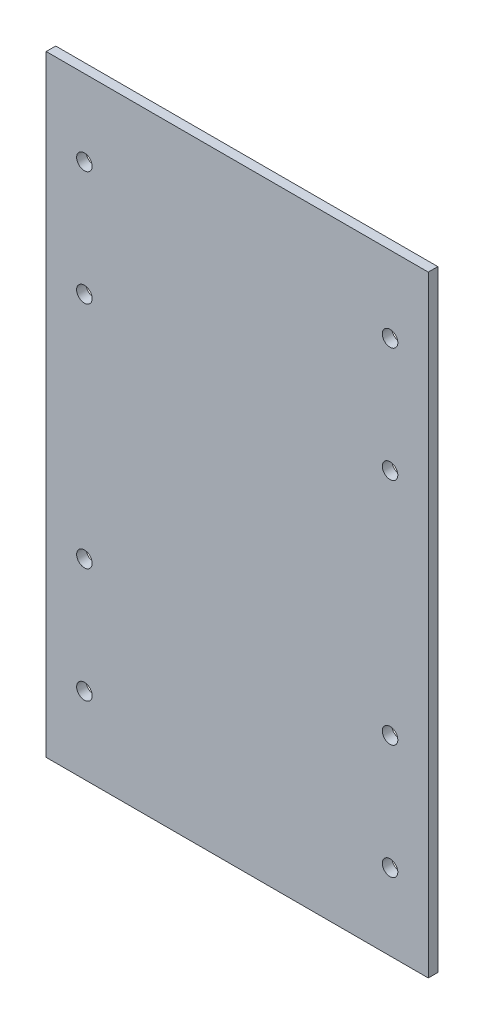
ISO-10303-21;
HEADER;
FILE_DESCRIPTION(('STEP AP214'),'2;1');
FILE_NAME('part.step','',(''),(''),'','','');
FILE_SCHEMA(('AUTOMOTIVE_DESIGN { 1 0 10303 214 1 1 1 1 }'));
ENDSEC;
DATA;
#1=APPLICATION_CONTEXT('core data for automotive mechanical design processes');
#2=APPLICATION_PROTOCOL_DEFINITION('international standard','automotive_design',2000,#1);
#3=PRODUCT_CONTEXT('',#1,'mechanical');
#4=PRODUCT('Part','Part','',(#3));
#5=PRODUCT_RELATED_PRODUCT_CATEGORY('part','',(#4));
#6=PRODUCT_DEFINITION_FORMATION('','',#4);
#7=PRODUCT_DEFINITION_CONTEXT('part definition',#1,'design');
#8=PRODUCT_DEFINITION('design','',#6,#7);
#9=PRODUCT_DEFINITION_SHAPE('','',#8);
#10=(LENGTH_UNIT() NAMED_UNIT(*) SI_UNIT(.MILLI.,.METRE.));
#11=(NAMED_UNIT(*) PLANE_ANGLE_UNIT() SI_UNIT($,.RADIAN.));
#12=(NAMED_UNIT(*) SI_UNIT($,.STERADIAN.) SOLID_ANGLE_UNIT());
#13=UNCERTAINTY_MEASURE_WITH_UNIT(LENGTH_MEASURE(1.E-05),#10,'distance_accuracy_value','');
#14=(GEOMETRIC_REPRESENTATION_CONTEXT(3) GLOBAL_UNCERTAINTY_ASSIGNED_CONTEXT((#13)) GLOBAL_UNIT_ASSIGNED_CONTEXT((#10,
#11,#12)) REPRESENTATION_CONTEXT('',''));
#15=CARTESIAN_POINT('',(0.,0.,0.));
#16=DIRECTION('',(0.,0.,1.));
#17=DIRECTION('',(1.,0.,0.));
#18=AXIS2_PLACEMENT_3D('',#15,#16,#17);
#19=CARTESIAN_POINT('',(63.5,-101.6,3.175));
#20=DIRECTION('',(-1.,0.,0.));
#21=DIRECTION('',(0.,0.,1.));
#22=AXIS2_PLACEMENT_3D('',#19,#20,#21);
#23=PLANE('',#22);
#24=DIRECTION('',(0.,1.,0.));
#25=VECTOR('',#24,1.);
#26=CARTESIAN_POINT('',(63.5,-101.6,0.));
#27=LINE('',#26,#25);
#28=CARTESIAN_POINT('',(63.5,-101.6,0.));
#29=VERTEX_POINT('',#28);
#30=CARTESIAN_POINT('',(63.5,101.6,0.));
#31=VERTEX_POINT('',#30);
#32=EDGE_CURVE('E99',#29,#31,#27,.T.);
#33=ORIENTED_EDGE('',*,*,#32,.T.);
#34=DIRECTION('',(0.,0.,-1.));
#35=VECTOR('',#34,1.);
#36=CARTESIAN_POINT('',(63.5,101.6,3.175));
#37=LINE('',#36,#35);
#38=CARTESIAN_POINT('',(63.5,101.6,3.175));
#39=VERTEX_POINT('',#38);
#40=EDGE_CURVE('E11',#39,#31,#37,.T.);
#41=ORIENTED_EDGE('',*,*,#40,.F.);
#42=DIRECTION('',(0.,1.,0.));
#43=VECTOR('',#42,1.);
#44=CARTESIAN_POINT('',(63.5,-101.6,3.175));
#45=LINE('',#44,#43);
#46=CARTESIAN_POINT('',(63.5,-101.6,3.175));
#47=VERTEX_POINT('',#46);
#48=EDGE_CURVE('E86',#47,#39,#45,.T.);
#49=ORIENTED_EDGE('',*,*,#48,.F.);
#50=DIRECTION('',(0.,0.,-1.));
#51=VECTOR('',#50,1.);
#52=CARTESIAN_POINT('',(63.5,-101.6,3.175));
#53=LINE('',#52,#51);
#54=EDGE_CURVE('E95',#47,#29,#53,.T.);
#55=ORIENTED_EDGE('',*,*,#54,.T.);
#56=EDGE_LOOP('',(#33,#41,#49,#55));
#57=FACE_BOUND('',#56,.T.);
#58=ADVANCED_FACE('F33',(#57),#23,.F.);
#59=CARTESIAN_POINT('',(-63.5,101.6,3.175));
#60=DIRECTION('',(0.,-1.,0.));
#61=DIRECTION('',(0.,0.,-1.));
#62=AXIS2_PLACEMENT_3D('',#59,#60,#61);
#63=PLANE('',#62);
#64=DIRECTION('',(-1.,0.,0.));
#65=VECTOR('',#64,1.);
#66=CARTESIAN_POINT('',(-63.5,101.6,0.));
#67=LINE('',#66,#65);
#68=CARTESIAN_POINT('',(-63.5,101.6,0.));
#69=VERTEX_POINT('',#68);
#70=EDGE_CURVE('E90',#31,#69,#67,.T.);
#71=ORIENTED_EDGE('',*,*,#70,.T.);
#72=DIRECTION('',(0.,0.,-1.));
#73=VECTOR('',#72,1.);
#74=CARTESIAN_POINT('',(-63.5,101.6,3.175));
#75=LINE('',#74,#73);
#76=CARTESIAN_POINT('',(-63.5,101.6,3.175));
#77=VERTEX_POINT('',#76);
#78=EDGE_CURVE('E42',#77,#69,#75,.T.);
#79=ORIENTED_EDGE('',*,*,#78,.F.);
#80=DIRECTION('',(-1.,0.,0.));
#81=VECTOR('',#80,1.);
#82=CARTESIAN_POINT('',(-63.5,101.6,3.175));
#83=LINE('',#82,#81);
#84=EDGE_CURVE('E81',#39,#77,#83,.T.);
#85=ORIENTED_EDGE('',*,*,#84,.F.);
#86=ORIENTED_EDGE('',*,*,#40,.T.);
#87=EDGE_LOOP('',(#71,#79,#85,#86));
#88=FACE_BOUND('',#87,.T.);
#89=ADVANCED_FACE('F89',(#88),#63,.F.);
#90=CARTESIAN_POINT('',(-63.5,-101.6,3.175));
#91=DIRECTION('',(1.,0.,0.));
#92=DIRECTION('',(0.,0.,-1.));
#93=AXIS2_PLACEMENT_3D('',#90,#91,#92);
#94=PLANE('',#93);
#95=DIRECTION('',(0.,-1.,0.));
#96=VECTOR('',#95,1.);
#97=CARTESIAN_POINT('',(-63.5,-101.6,0.));
#98=LINE('',#97,#96);
#99=CARTESIAN_POINT('',(-63.5,-101.6,0.));
#100=VERTEX_POINT('',#99);
#101=EDGE_CURVE('E68',#69,#100,#98,.T.);
#102=ORIENTED_EDGE('',*,*,#101,.T.);
#103=DIRECTION('',(0.,0.,-1.));
#104=VECTOR('',#103,1.);
#105=CARTESIAN_POINT('',(-63.5,-101.6,3.175));
#106=LINE('',#105,#104);
#107=CARTESIAN_POINT('',(-63.5,-101.6,3.175));
#108=VERTEX_POINT('',#107);
#109=EDGE_CURVE('E91',#108,#100,#106,.T.);
#110=ORIENTED_EDGE('',*,*,#109,.F.);
#111=DIRECTION('',(0.,-1.,0.));
#112=VECTOR('',#111,1.);
#113=CARTESIAN_POINT('',(-63.5,-101.6,3.175));
#114=LINE('',#113,#112);
#115=EDGE_CURVE('E84',#77,#108,#114,.T.);
#116=ORIENTED_EDGE('',*,*,#115,.F.);
#117=ORIENTED_EDGE('',*,*,#78,.T.);
#118=EDGE_LOOP('',(#102,#110,#116,#117));
#119=FACE_BOUND('',#118,.T.);
#120=ADVANCED_FACE('F93',(#119),#94,.F.);
#121=CARTESIAN_POINT('',(-63.5,-101.6,3.175));
#122=DIRECTION('',(0.,1.,0.));
#123=DIRECTION('',(0.,0.,1.));
#124=AXIS2_PLACEMENT_3D('',#121,#122,#123);
#125=PLANE('',#124);
#126=DIRECTION('',(1.,0.,0.));
#127=VECTOR('',#126,1.);
#128=CARTESIAN_POINT('',(-63.5,-101.6,0.));
#129=LINE('',#128,#127);
#130=EDGE_CURVE('E74',#100,#29,#129,.T.);
#131=ORIENTED_EDGE('',*,*,#130,.T.);
#132=ORIENTED_EDGE('',*,*,#54,.F.);
#133=DIRECTION('',(1.,0.,0.));
#134=VECTOR('',#133,1.);
#135=CARTESIAN_POINT('',(-63.5,-101.6,3.175));
#136=LINE('',#135,#134);
#137=EDGE_CURVE('E51',#108,#47,#136,.T.);
#138=ORIENTED_EDGE('',*,*,#137,.F.);
#139=ORIENTED_EDGE('',*,*,#109,.T.);
#140=EDGE_LOOP('',(#131,#132,#138,#139));
#141=FACE_BOUND('',#140,.T.);
#142=ADVANCED_FACE('F158',(#141),#125,.F.);
#143=CARTESIAN_POINT('',(0.,0.,3.175));
#144=DIRECTION('',(0.,0.,-1.));
#145=DIRECTION('',(-1.,0.,0.));
#146=AXIS2_PLACEMENT_3D('',#143,#144,#145);
#147=PLANE('',#146);
#148=CARTESIAN_POINT('',(50.8,38.1,3.175));
#149=DIRECTION('',(0.,0.,-1.));
#150=DIRECTION('',(-1.,0.,0.));
#151=AXIS2_PLACEMENT_3D('',#148,#149,#150);
#152=CIRCLE('',#151,2.5796875);
#153=CARTESIAN_POINT('',(48.2203125,38.1,3.175));
#154=VERTEX_POINT('',#153);
#155=EDGE_CURVE('E129',#154,#154,#152,.T.);
#156=ORIENTED_EDGE('',*,*,#155,.T.);
#157=EDGE_LOOP('',(#156));
#158=FACE_BOUND('',#157,.T.);
#159=CARTESIAN_POINT('',(50.8,-38.1,3.175));
#160=DIRECTION('',(0.,0.,-1.));
#161=DIRECTION('',(-1.,0.,0.));
#162=AXIS2_PLACEMENT_3D('',#159,#160,#161);
#163=CIRCLE('',#162,2.5796875);
#164=CARTESIAN_POINT('',(48.2203125,-38.1,3.175));
#165=VERTEX_POINT('',#164);
#166=EDGE_CURVE('E281',#165,#165,#163,.T.);
#167=ORIENTED_EDGE('',*,*,#166,.T.);
#168=EDGE_LOOP('',(#167));
#169=FACE_BOUND('',#168,.T.);
#170=CARTESIAN_POINT('',(50.8,-76.2,3.175));
#171=DIRECTION('',(0.,0.,-1.));
#172=DIRECTION('',(-1.,0.,0.));
#173=AXIS2_PLACEMENT_3D('',#170,#171,#172);
#174=CIRCLE('',#173,2.5796875);
#175=CARTESIAN_POINT('',(48.2203125,-76.2,3.175));
#176=VERTEX_POINT('',#175);
#177=EDGE_CURVE('E142',#176,#176,#174,.T.);
#178=ORIENTED_EDGE('',*,*,#177,.T.);
#179=EDGE_LOOP('',(#178));
#180=FACE_BOUND('',#179,.T.);
#181=CARTESIAN_POINT('',(50.8,76.2,3.175));
#182=DIRECTION('',(0.,0.,-1.));
#183=DIRECTION('',(-1.,0.,0.));
#184=AXIS2_PLACEMENT_3D('',#181,#182,#183);
#185=CIRCLE('',#184,2.5796875);
#186=CARTESIAN_POINT('',(48.2203125,76.2,3.175));
#187=VERTEX_POINT('',#186);
#188=EDGE_CURVE('E125',#187,#187,#185,.T.);
#189=ORIENTED_EDGE('',*,*,#188,.T.);
#190=EDGE_LOOP('',(#189));
#191=FACE_BOUND('',#190,.T.);
#192=CARTESIAN_POINT('',(-50.8,38.1,3.175));
#193=DIRECTION('',(0.,0.,1.));
#194=DIRECTION('',(1.,0.,0.));
#195=AXIS2_PLACEMENT_3D('',#192,#193,#194);
#196=CIRCLE('',#195,2.5796875);
#197=CARTESIAN_POINT('',(-48.2203125,38.1,3.175));
#198=VERTEX_POINT('',#197);
#199=EDGE_CURVE('E115',#198,#198,#196,.T.);
#200=ORIENTED_EDGE('',*,*,#199,.F.);
#201=EDGE_LOOP('',(#200));
#202=FACE_BOUND('',#201,.T.);
#203=CARTESIAN_POINT('',(-50.8,-38.1,3.175));
#204=DIRECTION('',(0.,0.,1.));
#205=DIRECTION('',(1.,0.,0.));
#206=AXIS2_PLACEMENT_3D('',#203,#204,#205);
#207=CIRCLE('',#206,2.5796875);
#208=CARTESIAN_POINT('',(-48.2203125,-38.1,3.175));
#209=VERTEX_POINT('',#208);
#210=EDGE_CURVE('E146',#209,#209,#207,.T.);
#211=ORIENTED_EDGE('',*,*,#210,.F.);
#212=EDGE_LOOP('',(#211));
#213=FACE_BOUND('',#212,.T.);
#214=CARTESIAN_POINT('',(-50.8,-76.2,3.175));
#215=DIRECTION('',(0.,0.,1.));
#216=DIRECTION('',(1.,0.,0.));
#217=AXIS2_PLACEMENT_3D('',#214,#215,#216);
#218=CIRCLE('',#217,2.5796875);
#219=CARTESIAN_POINT('',(-48.2203125,-76.2,3.175));
#220=VERTEX_POINT('',#219);
#221=EDGE_CURVE('E124',#220,#220,#218,.T.);
#222=ORIENTED_EDGE('',*,*,#221,.F.);
#223=EDGE_LOOP('',(#222));
#224=FACE_BOUND('',#223,.T.);
#225=CARTESIAN_POINT('',(-50.8,76.2,3.175));
#226=DIRECTION('',(0.,0.,1.));
#227=DIRECTION('',(1.,0.,0.));
#228=AXIS2_PLACEMENT_3D('',#225,#226,#227);
#229=CIRCLE('',#228,2.5796875);
#230=CARTESIAN_POINT('',(-48.2203125,76.2,3.175));
#231=VERTEX_POINT('',#230);
#232=EDGE_CURVE('E110',#231,#231,#229,.T.);
#233=ORIENTED_EDGE('',*,*,#232,.F.);
#234=EDGE_LOOP('',(#233));
#235=FACE_BOUND('',#234,.T.);
#236=ORIENTED_EDGE('',*,*,#48,.T.);
#237=ORIENTED_EDGE('',*,*,#84,.T.);
#238=ORIENTED_EDGE('',*,*,#115,.T.);
#239=ORIENTED_EDGE('',*,*,#137,.T.);
#240=EDGE_LOOP('',(#236,#237,#238,#239));
#241=FACE_BOUND('',#240,.T.);
#242=ADVANCED_FACE('F82',(#158,#169,#180,#191,#202,#213,#224,#235,#241),#147,.F.);
#243=CARTESIAN_POINT('',(0.,0.,0.));
#244=DIRECTION('',(0.,0.,-1.));
#245=DIRECTION('',(-1.,0.,0.));
#246=AXIS2_PLACEMENT_3D('',#243,#244,#245);
#247=PLANE('',#246);
#248=CARTESIAN_POINT('',(50.8,38.1,0.));
#249=DIRECTION('',(0.,0.,-1.));
#250=DIRECTION('',(-1.,0.,0.));
#251=AXIS2_PLACEMENT_3D('',#248,#249,#250);
#252=CIRCLE('',#251,2.5796875);
#253=CARTESIAN_POINT('',(48.2203125,38.1,0.));
#254=VERTEX_POINT('',#253);
#255=EDGE_CURVE('E36',#254,#254,#252,.F.);
#256=ORIENTED_EDGE('',*,*,#255,.T.);
#257=EDGE_LOOP('',(#256));
#258=FACE_BOUND('',#257,.T.);
#259=CARTESIAN_POINT('',(50.8,-38.1,0.));
#260=DIRECTION('',(0.,0.,-1.));
#261=DIRECTION('',(-1.,0.,0.));
#262=AXIS2_PLACEMENT_3D('',#259,#260,#261);
#263=CIRCLE('',#262,2.5796875);
#264=CARTESIAN_POINT('',(48.2203125,-38.1,0.));
#265=VERTEX_POINT('',#264);
#266=EDGE_CURVE('E128',#265,#265,#263,.F.);
#267=ORIENTED_EDGE('',*,*,#266,.T.);
#268=EDGE_LOOP('',(#267));
#269=FACE_BOUND('',#268,.T.);
#270=CARTESIAN_POINT('',(50.8,-76.2,0.));
#271=DIRECTION('',(0.,0.,-1.));
#272=DIRECTION('',(-1.,0.,0.));
#273=AXIS2_PLACEMENT_3D('',#270,#271,#272);
#274=CIRCLE('',#273,2.5796875);
#275=CARTESIAN_POINT('',(48.2203125,-76.2,0.));
#276=VERTEX_POINT('',#275);
#277=EDGE_CURVE('E126',#276,#276,#274,.F.);
#278=ORIENTED_EDGE('',*,*,#277,.T.);
#279=EDGE_LOOP('',(#278));
#280=FACE_BOUND('',#279,.T.);
#281=CARTESIAN_POINT('',(50.8,76.2,0.));
#282=DIRECTION('',(0.,0.,-1.));
#283=DIRECTION('',(-1.,0.,0.));
#284=AXIS2_PLACEMENT_3D('',#281,#282,#283);
#285=CIRCLE('',#284,2.5796875);
#286=CARTESIAN_POINT('',(48.2203125,76.2,0.));
#287=VERTEX_POINT('',#286);
#288=EDGE_CURVE('E121',#287,#287,#285,.F.);
#289=ORIENTED_EDGE('',*,*,#288,.T.);
#290=EDGE_LOOP('',(#289));
#291=FACE_BOUND('',#290,.T.);
#292=CARTESIAN_POINT('',(-50.8,38.1,0.));
#293=DIRECTION('',(0.,0.,-1.));
#294=DIRECTION('',(-1.,0.,0.));
#295=AXIS2_PLACEMENT_3D('',#292,#293,#294);
#296=CIRCLE('',#295,2.5796875);
#297=CARTESIAN_POINT('',(-53.3796875,38.1,0.));
#298=VERTEX_POINT('',#297);
#299=EDGE_CURVE('E118',#298,#298,#296,.T.);
#300=ORIENTED_EDGE('',*,*,#299,.F.);
#301=EDGE_LOOP('',(#300));
#302=FACE_BOUND('',#301,.T.);
#303=CARTESIAN_POINT('',(-50.8,-38.1,0.));
#304=DIRECTION('',(0.,0.,-1.));
#305=DIRECTION('',(-1.,0.,0.));
#306=AXIS2_PLACEMENT_3D('',#303,#304,#305);
#307=CIRCLE('',#306,2.5796875);
#308=CARTESIAN_POINT('',(-53.3796875,-38.1,0.));
#309=VERTEX_POINT('',#308);
#310=EDGE_CURVE('E114',#309,#309,#307,.T.);
#311=ORIENTED_EDGE('',*,*,#310,.F.);
#312=EDGE_LOOP('',(#311));
#313=FACE_BOUND('',#312,.T.);
#314=CARTESIAN_POINT('',(-50.8,-76.2,0.));
#315=DIRECTION('',(0.,0.,-1.));
#316=DIRECTION('',(-1.,0.,0.));
#317=AXIS2_PLACEMENT_3D('',#314,#315,#316);
#318=CIRCLE('',#317,2.5796875);
#319=CARTESIAN_POINT('',(-53.3796875,-76.2,0.));
#320=VERTEX_POINT('',#319);
#321=EDGE_CURVE('E111',#320,#320,#318,.T.);
#322=ORIENTED_EDGE('',*,*,#321,.F.);
#323=EDGE_LOOP('',(#322));
#324=FACE_BOUND('',#323,.T.);
#325=CARTESIAN_POINT('',(-50.8,76.2,0.));
#326=DIRECTION('',(0.,0.,-1.));
#327=DIRECTION('',(-1.,0.,0.));
#328=AXIS2_PLACEMENT_3D('',#325,#326,#327);
#329=CIRCLE('',#328,2.5796875);
#330=CARTESIAN_POINT('',(-53.3796875,76.2,0.));
#331=VERTEX_POINT('',#330);
#332=EDGE_CURVE('E102',#331,#331,#329,.T.);
#333=ORIENTED_EDGE('',*,*,#332,.F.);
#334=EDGE_LOOP('',(#333));
#335=FACE_BOUND('',#334,.T.);
#336=ORIENTED_EDGE('',*,*,#32,.F.);
#337=ORIENTED_EDGE('',*,*,#130,.F.);
#338=ORIENTED_EDGE('',*,*,#101,.F.);
#339=ORIENTED_EDGE('',*,*,#70,.F.);
#340=EDGE_LOOP('',(#336,#337,#338,#339));
#341=FACE_BOUND('',#340,.T.);
#342=ADVANCED_FACE('F157',(#258,#269,#280,#291,#302,#313,#324,#335,#341),#247,.T.);
#343=CARTESIAN_POINT('',(-50.8,76.2,-3.175));
#344=DIRECTION('',(0.,0.,1.));
#345=DIRECTION('',(1.,0.,0.));
#346=AXIS2_PLACEMENT_3D('',#343,#344,#345);
#347=CYLINDRICAL_SURFACE('',#346,2.5796875);
#348=ORIENTED_EDGE('',*,*,#332,.T.);
#349=EDGE_LOOP('',(#348));
#350=FACE_BOUND('',#349,.T.);
#351=ORIENTED_EDGE('',*,*,#232,.T.);
#352=EDGE_LOOP('',(#351));
#353=FACE_BOUND('',#352,.T.);
#354=ADVANCED_FACE('F154',(#350,#353),#347,.F.);
#355=CARTESIAN_POINT('',(-50.8,-76.2,-3.175));
#356=DIRECTION('',(0.,0.,1.));
#357=DIRECTION('',(1.,0.,0.));
#358=AXIS2_PLACEMENT_3D('',#355,#356,#357);
#359=CYLINDRICAL_SURFACE('',#358,2.5796875);
#360=ORIENTED_EDGE('',*,*,#321,.T.);
#361=EDGE_LOOP('',(#360));
#362=FACE_BOUND('',#361,.T.);
#363=ORIENTED_EDGE('',*,*,#221,.T.);
#364=EDGE_LOOP('',(#363));
#365=FACE_BOUND('',#364,.T.);
#366=ADVANCED_FACE('F197',(#362,#365),#359,.F.);
#367=CARTESIAN_POINT('',(-50.8,-38.1,-3.175));
#368=DIRECTION('',(0.,0.,1.));
#369=DIRECTION('',(1.,0.,0.));
#370=AXIS2_PLACEMENT_3D('',#367,#368,#369);
#371=CYLINDRICAL_SURFACE('',#370,2.5796875);
#372=ORIENTED_EDGE('',*,*,#310,.T.);
#373=EDGE_LOOP('',(#372));
#374=FACE_BOUND('',#373,.T.);
#375=ORIENTED_EDGE('',*,*,#210,.T.);
#376=EDGE_LOOP('',(#375));
#377=FACE_BOUND('',#376,.T.);
#378=ADVANCED_FACE('F207',(#374,#377),#371,.F.);
#379=CARTESIAN_POINT('',(-50.8,38.1,-3.175));
#380=DIRECTION('',(0.,0.,1.));
#381=DIRECTION('',(1.,0.,0.));
#382=AXIS2_PLACEMENT_3D('',#379,#380,#381);
#383=CYLINDRICAL_SURFACE('',#382,2.5796875);
#384=ORIENTED_EDGE('',*,*,#299,.T.);
#385=EDGE_LOOP('',(#384));
#386=FACE_BOUND('',#385,.T.);
#387=ORIENTED_EDGE('',*,*,#199,.T.);
#388=EDGE_LOOP('',(#387));
#389=FACE_BOUND('',#388,.T.);
#390=ADVANCED_FACE('F217',(#386,#389),#383,.F.);
#391=CARTESIAN_POINT('',(50.8,76.2,-3.175));
#392=DIRECTION('',(0.,0.,1.));
#393=DIRECTION('',(1.,0.,0.));
#394=AXIS2_PLACEMENT_3D('',#391,#392,#393);
#395=CYLINDRICAL_SURFACE('',#394,2.5796875);
#396=ORIENTED_EDGE('',*,*,#288,.F.);
#397=EDGE_LOOP('',(#396));
#398=FACE_BOUND('',#397,.T.);
#399=ORIENTED_EDGE('',*,*,#188,.F.);
#400=EDGE_LOOP('',(#399));
#401=FACE_BOUND('',#400,.T.);
#402=ADVANCED_FACE('F226',(#398,#401),#395,.F.);
#403=CARTESIAN_POINT('',(50.8,-76.2,-3.175));
#404=DIRECTION('',(0.,0.,1.));
#405=DIRECTION('',(1.,0.,0.));
#406=AXIS2_PLACEMENT_3D('',#403,#404,#405);
#407=CYLINDRICAL_SURFACE('',#406,2.5796875);
#408=ORIENTED_EDGE('',*,*,#277,.F.);
#409=EDGE_LOOP('',(#408));
#410=FACE_BOUND('',#409,.T.);
#411=ORIENTED_EDGE('',*,*,#177,.F.);
#412=EDGE_LOOP('',(#411));
#413=FACE_BOUND('',#412,.T.);
#414=ADVANCED_FACE('F245',(#410,#413),#407,.F.);
#415=CARTESIAN_POINT('',(50.8,-38.1,-3.175));
#416=DIRECTION('',(0.,0.,1.));
#417=DIRECTION('',(1.,0.,0.));
#418=AXIS2_PLACEMENT_3D('',#415,#416,#417);
#419=CYLINDRICAL_SURFACE('',#418,2.5796875);
#420=ORIENTED_EDGE('',*,*,#266,.F.);
#421=EDGE_LOOP('',(#420));
#422=FACE_BOUND('',#421,.T.);
#423=ORIENTED_EDGE('',*,*,#166,.F.);
#424=EDGE_LOOP('',(#423));
#425=FACE_BOUND('',#424,.T.);
#426=ADVANCED_FACE('F255',(#422,#425),#419,.F.);
#427=CARTESIAN_POINT('',(50.8,38.1,-3.175));
#428=DIRECTION('',(0.,0.,1.));
#429=DIRECTION('',(1.,0.,0.));
#430=AXIS2_PLACEMENT_3D('',#427,#428,#429);
#431=CYLINDRICAL_SURFACE('',#430,2.5796875);
#432=ORIENTED_EDGE('',*,*,#255,.F.);
#433=EDGE_LOOP('',(#432));
#434=FACE_BOUND('',#433,.T.);
#435=ORIENTED_EDGE('',*,*,#155,.F.);
#436=EDGE_LOOP('',(#435));
#437=FACE_BOUND('',#436,.T.);
#438=ADVANCED_FACE('F265',(#434,#437),#431,.F.);
#439=CLOSED_SHELL('',(#58,#89,#120,#142,#242,#342,#354,#366,#378,#390,#402,#414,#426,#438));
#440=MANIFOLD_SOLID_BREP('B2',#439);
#441=ADVANCED_BREP_SHAPE_REPRESENTATION('',(#18,#440),#14);
#442=SHAPE_DEFINITION_REPRESENTATION(#9,#441);
ENDSEC;
END-ISO-10303-21;
